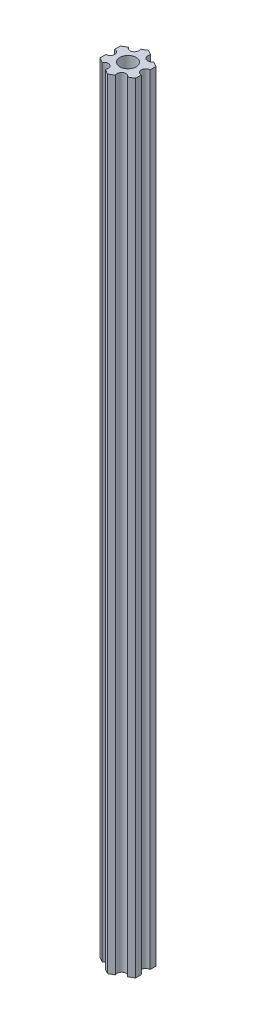
ISO-10303-21;
HEADER;
FILE_DESCRIPTION(('STEP AP214'),'2;1');
FILE_NAME('part.step','',(''),(''),'','','');
FILE_SCHEMA(('AUTOMOTIVE_DESIGN { 1 0 10303 214 1 1 1 1 }'));
ENDSEC;
DATA;
#1=APPLICATION_CONTEXT('core data for automotive mechanical design processes');
#2=APPLICATION_PROTOCOL_DEFINITION('international standard','automotive_design',2000,#1);
#3=PRODUCT_CONTEXT('',#1,'mechanical');
#4=PRODUCT('Part','Part','',(#3));
#5=PRODUCT_RELATED_PRODUCT_CATEGORY('part','',(#4));
#6=PRODUCT_DEFINITION_FORMATION('','',#4);
#7=PRODUCT_DEFINITION_CONTEXT('part definition',#1,'design');
#8=PRODUCT_DEFINITION('design','',#6,#7);
#9=PRODUCT_DEFINITION_SHAPE('','',#8);
#10=(LENGTH_UNIT() NAMED_UNIT(*) SI_UNIT(.MILLI.,.METRE.));
#11=(NAMED_UNIT(*) PLANE_ANGLE_UNIT() SI_UNIT($,.RADIAN.));
#12=(NAMED_UNIT(*) SI_UNIT($,.STERADIAN.) SOLID_ANGLE_UNIT());
#13=UNCERTAINTY_MEASURE_WITH_UNIT(LENGTH_MEASURE(1.E-05),#10,'distance_accuracy_value','');
#14=(GEOMETRIC_REPRESENTATION_CONTEXT(3) GLOBAL_UNCERTAINTY_ASSIGNED_CONTEXT((#13)) GLOBAL_UNIT_ASSIGNED_CONTEXT((#10,
#11,#12)) REPRESENTATION_CONTEXT('',''));
#15=CARTESIAN_POINT('',(0.,0.,0.));
#16=DIRECTION('',(0.,0.,1.));
#17=DIRECTION('',(1.,0.,0.));
#18=AXIS2_PLACEMENT_3D('',#15,#16,#17);
#19=CARTESIAN_POINT('',(3.175,-279.146,5.49926131403119));
#20=DIRECTION('',(0.,1.,0.));
#21=DIRECTION('',(-0.866025403784439,0.,0.5));
#22=AXIS2_PLACEMENT_3D('',#19,#20,#21);
#23=CYLINDRICAL_SURFACE('',#22,1.5875);
#24=DIRECTION('',(0.,-1.,0.));
#25=VECTOR('',#24,1.);
#26=CARTESIAN_POINT('',(1.8001846714922,-279.146,6.29301131403118));
#27=LINE('',#26,#25);
#28=CARTESIAN_POINT('',(1.8001846714922,0.,6.29301131403119));
#29=VERTEX_POINT('',#28);
#30=CARTESIAN_POINT('',(1.8001846714922,-279.146,6.29301131403119));
#31=VERTEX_POINT('',#30);
#32=EDGE_CURVE('E192',#29,#31,#27,.T.);
#33=ORIENTED_EDGE('',*,*,#32,.T.);
#34=CARTESIAN_POINT('',(3.175,-279.146,5.49926131403119));
#35=DIRECTION('',(0.,-1.,0.));
#36=DIRECTION('',(0.866025403784439,0.,-0.5));
#37=AXIS2_PLACEMENT_3D('',#34,#35,#36);
#38=CIRCLE('',#37,1.5875);
#39=CARTESIAN_POINT('',(4.5498153285078,-279.146,4.70551131403118));
#40=VERTEX_POINT('',#39);
#41=EDGE_CURVE('E274',#31,#40,#38,.T.);
#42=ORIENTED_EDGE('',*,*,#41,.T.);
#43=DIRECTION('',(0.,1.,0.));
#44=VECTOR('',#43,1.);
#45=CARTESIAN_POINT('',(4.5498153285078,-279.146,4.70551131403118));
#46=LINE('',#45,#44);
#47=CARTESIAN_POINT('',(4.5498153285078,0.,4.70551131403119));
#48=VERTEX_POINT('',#47);
#49=EDGE_CURVE('E194',#40,#48,#46,.T.);
#50=ORIENTED_EDGE('',*,*,#49,.T.);
#51=CARTESIAN_POINT('',(3.175,0.,5.49926131403119));
#52=DIRECTION('',(0.,-1.,0.));
#53=DIRECTION('',(0.866025403784439,0.,-0.5));
#54=AXIS2_PLACEMENT_3D('',#51,#52,#53);
#55=CIRCLE('',#54,1.5875);
#56=EDGE_CURVE('E189',#29,#48,#55,.T.);
#57=ORIENTED_EDGE('',*,*,#56,.F.);
#58=EDGE_LOOP('',(#33,#42,#50,#57));
#59=FACE_BOUND('',#58,.T.);
#60=ADVANCED_FACE('F17',(#59),#23,.F.);
#61=CARTESIAN_POINT('',(-3.175,-279.146,5.49926131403119));
#62=DIRECTION('',(0.,1.,0.));
#63=DIRECTION('',(-0.866025403784439,0.,-0.5));
#64=AXIS2_PLACEMENT_3D('',#61,#62,#63);
#65=CYLINDRICAL_SURFACE('',#64,1.5875);
#66=DIRECTION('',(0.,-1.,0.));
#67=VECTOR('',#66,1.);
#68=CARTESIAN_POINT('',(-4.5498153285078,-279.146,4.70551131403119));
#69=LINE('',#68,#67);
#70=CARTESIAN_POINT('',(-4.5498153285078,0.,4.70551131403119));
#71=VERTEX_POINT('',#70);
#72=CARTESIAN_POINT('',(-4.5498153285078,-279.146,4.70551131403119));
#73=VERTEX_POINT('',#72);
#74=EDGE_CURVE('E242',#71,#73,#69,.T.);
#75=ORIENTED_EDGE('',*,*,#74,.T.);
#76=CARTESIAN_POINT('',(-3.175,-279.146,5.49926131403119));
#77=DIRECTION('',(0.,-1.,0.));
#78=DIRECTION('',(0.866025403784439,0.,0.5));
#79=AXIS2_PLACEMENT_3D('',#76,#77,#78);
#80=CIRCLE('',#79,1.5875);
#81=CARTESIAN_POINT('',(-1.8001846714922,-279.146,6.29301131403119));
#82=VERTEX_POINT('',#81);
#83=EDGE_CURVE('E238',#73,#82,#80,.T.);
#84=ORIENTED_EDGE('',*,*,#83,.T.);
#85=DIRECTION('',(0.,1.,0.));
#86=VECTOR('',#85,1.);
#87=CARTESIAN_POINT('',(-1.8001846714922,-279.146,6.29301131403119));
#88=LINE('',#87,#86);
#89=CARTESIAN_POINT('',(-1.8001846714922,0.,6.29301131403119));
#90=VERTEX_POINT('',#89);
#91=EDGE_CURVE('E252',#82,#90,#88,.T.);
#92=ORIENTED_EDGE('',*,*,#91,.T.);
#93=CARTESIAN_POINT('',(-3.175,0.,5.49926131403119));
#94=DIRECTION('',(0.,-1.,0.));
#95=DIRECTION('',(0.866025403784439,0.,0.5));
#96=AXIS2_PLACEMENT_3D('',#93,#94,#95);
#97=CIRCLE('',#96,1.5875);
#98=EDGE_CURVE('E11',#71,#90,#97,.T.);
#99=ORIENTED_EDGE('',*,*,#98,.F.);
#100=EDGE_LOOP('',(#75,#84,#92,#99));
#101=FACE_BOUND('',#100,.T.);
#102=ADVANCED_FACE('F432',(#101),#65,.F.);
#103=CARTESIAN_POINT('',(-6.35,-279.146,0.));
#104=DIRECTION('',(0.,1.,0.));
#105=DIRECTION('',(0.,0.,-1.));
#106=AXIS2_PLACEMENT_3D('',#103,#104,#105);
#107=CYLINDRICAL_SURFACE('',#106,1.5875);
#108=DIRECTION('',(0.,-1.,0.));
#109=VECTOR('',#108,1.);
#110=CARTESIAN_POINT('',(-6.35,-279.146,-1.5875));
#111=LINE('',#110,#109);
#112=CARTESIAN_POINT('',(-6.35,0.,-1.5875));
#113=VERTEX_POINT('',#112);
#114=CARTESIAN_POINT('',(-6.35,-279.146,-1.5875));
#115=VERTEX_POINT('',#114);
#116=EDGE_CURVE('E271',#113,#115,#111,.T.);
#117=ORIENTED_EDGE('',*,*,#116,.T.);
#118=CARTESIAN_POINT('',(-6.35,-279.146,0.));
#119=DIRECTION('',(0.,-1.,0.));
#120=DIRECTION('',(0.,0.,1.));
#121=AXIS2_PLACEMENT_3D('',#118,#119,#120);
#122=CIRCLE('',#121,1.5875);
#123=CARTESIAN_POINT('',(-6.35,-279.146,1.5875));
#124=VERTEX_POINT('',#123);
#125=EDGE_CURVE('E234',#115,#124,#122,.T.);
#126=ORIENTED_EDGE('',*,*,#125,.T.);
#127=DIRECTION('',(0.,1.,0.));
#128=VECTOR('',#127,1.);
#129=CARTESIAN_POINT('',(-6.35,-279.146,1.5875));
#130=LINE('',#129,#128);
#131=CARTESIAN_POINT('',(-6.35,0.,1.5875));
#132=VERTEX_POINT('',#131);
#133=EDGE_CURVE('E316',#124,#132,#130,.T.);
#134=ORIENTED_EDGE('',*,*,#133,.T.);
#135=CARTESIAN_POINT('',(-6.35,0.,0.));
#136=DIRECTION('',(0.,-1.,0.));
#137=DIRECTION('',(0.,0.,1.));
#138=AXIS2_PLACEMENT_3D('',#135,#136,#137);
#139=CIRCLE('',#138,1.5875);
#140=EDGE_CURVE('E25',#113,#132,#139,.T.);
#141=ORIENTED_EDGE('',*,*,#140,.F.);
#142=EDGE_LOOP('',(#117,#126,#134,#141));
#143=FACE_BOUND('',#142,.T.);
#144=ADVANCED_FACE('F423',(#143),#107,.F.);
#145=CARTESIAN_POINT('',(-3.175,-279.146,-5.49926131403118));
#146=DIRECTION('',(0.,1.,0.));
#147=DIRECTION('',(0.866025403784439,0.,-0.5));
#148=AXIS2_PLACEMENT_3D('',#145,#146,#147);
#149=CYLINDRICAL_SURFACE('',#148,1.5875);
#150=DIRECTION('',(0.,-1.,0.));
#151=VECTOR('',#150,1.);
#152=CARTESIAN_POINT('',(-1.8001846714922,-279.146,-6.29301131403118));
#153=LINE('',#152,#151);
#154=CARTESIAN_POINT('',(-1.8001846714922,0.,-6.29301131403118));
#155=VERTEX_POINT('',#154);
#156=CARTESIAN_POINT('',(-1.8001846714922,-279.146,-6.29301131403118));
#157=VERTEX_POINT('',#156);
#158=EDGE_CURVE('E336',#155,#157,#153,.T.);
#159=ORIENTED_EDGE('',*,*,#158,.T.);
#160=CARTESIAN_POINT('',(-3.175,-279.146,-5.49926131403118));
#161=DIRECTION('',(0.,-1.,0.));
#162=DIRECTION('',(-0.866025403784439,0.,0.5));
#163=AXIS2_PLACEMENT_3D('',#160,#161,#162);
#164=CIRCLE('',#163,1.5875);
#165=CARTESIAN_POINT('',(-4.5498153285078,-279.146,-4.70551131403118));
#166=VERTEX_POINT('',#165);
#167=EDGE_CURVE('E237',#157,#166,#164,.T.);
#168=ORIENTED_EDGE('',*,*,#167,.T.);
#169=DIRECTION('',(0.,1.,0.));
#170=VECTOR('',#169,1.);
#171=CARTESIAN_POINT('',(-4.5498153285078,-279.146,-4.70551131403118));
#172=LINE('',#171,#170);
#173=CARTESIAN_POINT('',(-4.5498153285078,0.,-4.70551131403118));
#174=VERTEX_POINT('',#173);
#175=EDGE_CURVE('E227',#166,#174,#172,.T.);
#176=ORIENTED_EDGE('',*,*,#175,.T.);
#177=CARTESIAN_POINT('',(-3.175,0.,-5.49926131403118));
#178=DIRECTION('',(0.,-1.,0.));
#179=DIRECTION('',(-0.866025403784439,0.,0.5));
#180=AXIS2_PLACEMENT_3D('',#177,#178,#179);
#181=CIRCLE('',#180,1.5875);
#182=EDGE_CURVE('E223',#155,#174,#181,.T.);
#183=ORIENTED_EDGE('',*,*,#182,.F.);
#184=EDGE_LOOP('',(#159,#168,#176,#183));
#185=FACE_BOUND('',#184,.T.);
#186=ADVANCED_FACE('F408',(#185),#149,.F.);
#187=CARTESIAN_POINT('',(3.175,-279.146,-5.49926131403119));
#188=DIRECTION('',(0.,1.,0.));
#189=DIRECTION('',(0.866025403784439,0.,0.5));
#190=AXIS2_PLACEMENT_3D('',#187,#188,#189);
#191=CYLINDRICAL_SURFACE('',#190,1.5875);
#192=DIRECTION('',(0.,-1.,0.));
#193=VECTOR('',#192,1.);
#194=CARTESIAN_POINT('',(4.5498153285078,-279.146,-4.70551131403119));
#195=LINE('',#194,#193);
#196=CARTESIAN_POINT('',(4.5498153285078,0.,-4.70551131403119));
#197=VERTEX_POINT('',#196);
#198=CARTESIAN_POINT('',(4.5498153285078,-279.146,-4.70551131403119));
#199=VERTEX_POINT('',#198);
#200=EDGE_CURVE('E258',#197,#199,#195,.T.);
#201=ORIENTED_EDGE('',*,*,#200,.T.);
#202=CARTESIAN_POINT('',(3.175,-279.146,-5.49926131403119));
#203=DIRECTION('',(0.,-1.,0.));
#204=DIRECTION('',(-0.866025403784439,0.,-0.5));
#205=AXIS2_PLACEMENT_3D('',#202,#203,#204);
#206=CIRCLE('',#205,1.5875);
#207=CARTESIAN_POINT('',(1.8001846714922,-279.146,-6.29301131403119));
#208=VERTEX_POINT('',#207);
#209=EDGE_CURVE('E233',#199,#208,#206,.T.);
#210=ORIENTED_EDGE('',*,*,#209,.T.);
#211=DIRECTION('',(0.,1.,0.));
#212=VECTOR('',#211,1.);
#213=CARTESIAN_POINT('',(1.8001846714922,-279.146,-6.29301131403119));
#214=LINE('',#213,#212);
#215=CARTESIAN_POINT('',(1.8001846714922,0.,-6.29301131403119));
#216=VERTEX_POINT('',#215);
#217=EDGE_CURVE('E321',#208,#216,#214,.T.);
#218=ORIENTED_EDGE('',*,*,#217,.T.);
#219=CARTESIAN_POINT('',(3.175,0.,-5.49926131403119));
#220=DIRECTION('',(0.,-1.,0.));
#221=DIRECTION('',(-0.866025403784439,0.,-0.5));
#222=AXIS2_PLACEMENT_3D('',#219,#220,#221);
#223=CIRCLE('',#222,1.5875);
#224=EDGE_CURVE('E221',#197,#216,#223,.T.);
#225=ORIENTED_EDGE('',*,*,#224,.F.);
#226=EDGE_LOOP('',(#201,#210,#218,#225));
#227=FACE_BOUND('',#226,.T.);
#228=ADVANCED_FACE('F454',(#227),#191,.F.);
#229=CARTESIAN_POINT('',(6.35,-279.146,0.));
#230=DIRECTION('',(0.,1.,0.));
#231=DIRECTION('',(0.,0.,1.));
#232=AXIS2_PLACEMENT_3D('',#229,#230,#231);
#233=CYLINDRICAL_SURFACE('',#232,1.5875);
#234=DIRECTION('',(0.,-1.,0.));
#235=VECTOR('',#234,1.);
#236=CARTESIAN_POINT('',(6.35,-279.146,1.5875));
#237=LINE('',#236,#235);
#238=CARTESIAN_POINT('',(6.35,0.,1.5875));
#239=VERTEX_POINT('',#238);
#240=CARTESIAN_POINT('',(6.35,-279.146,1.5875));
#241=VERTEX_POINT('',#240);
#242=EDGE_CURVE('E378',#239,#241,#237,.T.);
#243=ORIENTED_EDGE('',*,*,#242,.T.);
#244=CARTESIAN_POINT('',(6.35,-279.146,0.));
#245=DIRECTION('',(0.,-1.,0.));
#246=DIRECTION('',(0.,0.,-1.));
#247=AXIS2_PLACEMENT_3D('',#244,#245,#246);
#248=CIRCLE('',#247,1.5875);
#249=CARTESIAN_POINT('',(6.35,-279.146,-1.5875));
#250=VERTEX_POINT('',#249);
#251=EDGE_CURVE('E230',#241,#250,#248,.T.);
#252=ORIENTED_EDGE('',*,*,#251,.T.);
#253=DIRECTION('',(0.,1.,0.));
#254=VECTOR('',#253,1.);
#255=CARTESIAN_POINT('',(6.35,-279.146,-1.5875));
#256=LINE('',#255,#254);
#257=CARTESIAN_POINT('',(6.35,0.,-1.5875));
#258=VERTEX_POINT('',#257);
#259=EDGE_CURVE('E299',#250,#258,#256,.T.);
#260=ORIENTED_EDGE('',*,*,#259,.T.);
#261=CARTESIAN_POINT('',(6.35,0.,0.));
#262=DIRECTION('',(0.,-1.,0.));
#263=DIRECTION('',(0.,0.,-1.));
#264=AXIS2_PLACEMENT_3D('',#261,#262,#263);
#265=CIRCLE('',#264,1.5875);
#266=EDGE_CURVE('E199',#239,#258,#265,.T.);
#267=ORIENTED_EDGE('',*,*,#266,.F.);
#268=EDGE_LOOP('',(#243,#252,#260,#267));
#269=FACE_BOUND('',#268,.T.);
#270=ADVANCED_FACE('F443',(#269),#233,.F.);
#271=CARTESIAN_POINT('',(0.,-279.146,0.));
#272=DIRECTION('',(0.,1.,0.));
#273=DIRECTION('',(0.,0.,1.));
#274=AXIS2_PLACEMENT_3D('',#271,#272,#273);
#275=CYLINDRICAL_SURFACE('',#274,2.9337);
#276=CARTESIAN_POINT('',(0.,0.,0.));
#277=DIRECTION('',(0.,-1.,0.));
#278=DIRECTION('',(0.,0.,-1.));
#279=AXIS2_PLACEMENT_3D('',#276,#277,#278);
#280=CIRCLE('',#279,2.9337);
#281=CARTESIAN_POINT('',(0.,0.,-2.9337));
#282=VERTEX_POINT('',#281);
#283=EDGE_CURVE('E35',#282,#282,#280,.T.);
#284=ORIENTED_EDGE('',*,*,#283,.F.);
#285=EDGE_LOOP('',(#284));
#286=FACE_BOUND('',#285,.T.);
#287=CARTESIAN_POINT('',(0.,-279.146,0.));
#288=DIRECTION('',(0.,-1.,0.));
#289=DIRECTION('',(0.,0.,-1.));
#290=AXIS2_PLACEMENT_3D('',#287,#288,#289);
#291=CIRCLE('',#290,2.9337);
#292=CARTESIAN_POINT('',(0.,-279.146,-2.9337));
#293=VERTEX_POINT('',#292);
#294=EDGE_CURVE('E42',#293,#293,#291,.T.);
#295=ORIENTED_EDGE('',*,*,#294,.T.);
#296=EDGE_LOOP('',(#295));
#297=FACE_BOUND('',#296,.T.);
#298=ADVANCED_FACE('F486',(#286,#297),#275,.F.);
#299=CARTESIAN_POINT('',(0.,0.,0.));
#300=DIRECTION('',(0.,-1.,0.));
#301=DIRECTION('',(0.,0.,-1.));
#302=AXIS2_PLACEMENT_3D('',#299,#300,#301);
#303=PLANE('',#302);
#304=DIRECTION('',(-0.866025403784439,0.,0.5));
#305=VECTOR('',#304,1.);
#306=CARTESIAN_POINT('',(3.175,0.,5.49926131403118));
#307=LINE('',#306,#305);
#308=CARTESIAN_POINT('',(0.,0.,7.33234841870825));
#309=VERTEX_POINT('',#308);
#310=EDGE_CURVE('E202',#29,#309,#307,.T.);
#311=ORIENTED_EDGE('',*,*,#310,.F.);
#312=ORIENTED_EDGE('',*,*,#56,.T.);
#313=DIRECTION('',(-0.866025403784439,0.,0.5));
#314=VECTOR('',#313,1.);
#315=CARTESIAN_POINT('',(3.175,0.,5.49926131403118));
#316=LINE('',#315,#314);
#317=CARTESIAN_POINT('',(6.35,0.,3.66617420935412));
#318=VERTEX_POINT('',#317);
#319=EDGE_CURVE('E239',#318,#48,#316,.T.);
#320=ORIENTED_EDGE('',*,*,#319,.F.);
#321=DIRECTION('',(0.,0.,1.));
#322=VECTOR('',#321,1.);
#323=CARTESIAN_POINT('',(6.35,0.,0.));
#324=LINE('',#323,#322);
#325=EDGE_CURVE('E382',#239,#318,#324,.T.);
#326=ORIENTED_EDGE('',*,*,#325,.F.);
#327=ORIENTED_EDGE('',*,*,#266,.T.);
#328=DIRECTION('',(0.,0.,1.));
#329=VECTOR('',#328,1.);
#330=CARTESIAN_POINT('',(6.35,0.,0.));
#331=LINE('',#330,#329);
#332=CARTESIAN_POINT('',(6.35,0.,-3.66617420935413));
#333=VERTEX_POINT('',#332);
#334=EDGE_CURVE('E275',#333,#258,#331,.T.);
#335=ORIENTED_EDGE('',*,*,#334,.F.);
#336=DIRECTION('',(0.866025403784439,0.,0.5));
#337=VECTOR('',#336,1.);
#338=CARTESIAN_POINT('',(3.175,0.,-5.49926131403119));
#339=LINE('',#338,#337);
#340=EDGE_CURVE('E253',#197,#333,#339,.T.);
#341=ORIENTED_EDGE('',*,*,#340,.F.);
#342=ORIENTED_EDGE('',*,*,#224,.T.);
#343=DIRECTION('',(0.866025403784439,0.,0.5));
#344=VECTOR('',#343,1.);
#345=CARTESIAN_POINT('',(3.175,0.,-5.49926131403119));
#346=LINE('',#345,#344);
#347=CARTESIAN_POINT('',(0.,0.,-7.33234841870825));
#348=VERTEX_POINT('',#347);
#349=EDGE_CURVE('E374',#348,#216,#346,.T.);
#350=ORIENTED_EDGE('',*,*,#349,.F.);
#351=DIRECTION('',(0.866025403784439,0.,-0.5));
#352=VECTOR('',#351,1.);
#353=CARTESIAN_POINT('',(-3.175,0.,-5.49926131403119));
#354=LINE('',#353,#352);
#355=EDGE_CURVE('E343',#155,#348,#354,.T.);
#356=ORIENTED_EDGE('',*,*,#355,.F.);
#357=ORIENTED_EDGE('',*,*,#182,.T.);
#358=DIRECTION('',(0.866025403784439,0.,-0.5));
#359=VECTOR('',#358,1.);
#360=CARTESIAN_POINT('',(-3.175,0.,-5.49926131403119));
#361=LINE('',#360,#359);
#362=CARTESIAN_POINT('',(-6.35,0.,-3.66617420935412));
#363=VERTEX_POINT('',#362);
#364=EDGE_CURVE('E357',#363,#174,#361,.T.);
#365=ORIENTED_EDGE('',*,*,#364,.F.);
#366=DIRECTION('',(0.,0.,-1.));
#367=VECTOR('',#366,1.);
#368=CARTESIAN_POINT('',(-6.35,0.,0.));
#369=LINE('',#368,#367);
#370=EDGE_CURVE('E290',#113,#363,#369,.T.);
#371=ORIENTED_EDGE('',*,*,#370,.F.);
#372=ORIENTED_EDGE('',*,*,#140,.T.);
#373=DIRECTION('',(0.,0.,-1.));
#374=VECTOR('',#373,1.);
#375=CARTESIAN_POINT('',(-6.35,0.,0.));
#376=LINE('',#375,#374);
#377=CARTESIAN_POINT('',(-6.35,0.,3.66617420935413));
#378=VERTEX_POINT('',#377);
#379=EDGE_CURVE('E329',#378,#132,#376,.T.);
#380=ORIENTED_EDGE('',*,*,#379,.F.);
#381=DIRECTION('',(-0.866025403784439,0.,-0.5));
#382=VECTOR('',#381,1.);
#383=CARTESIAN_POINT('',(-3.175,0.,5.49926131403119));
#384=LINE('',#383,#382);
#385=EDGE_CURVE('E283',#71,#378,#384,.T.);
#386=ORIENTED_EDGE('',*,*,#385,.F.);
#387=ORIENTED_EDGE('',*,*,#98,.T.);
#388=DIRECTION('',(-0.866025403784439,0.,-0.5));
#389=VECTOR('',#388,1.);
#390=CARTESIAN_POINT('',(-3.175,0.,5.49926131403119));
#391=LINE('',#390,#389);
#392=EDGE_CURVE('E205',#309,#90,#391,.T.);
#393=ORIENTED_EDGE('',*,*,#392,.F.);
#394=EDGE_LOOP('',(#311,#312,#320,#326,#327,#335,#341,#342,#350,#356,#357,#365,#371,#372,#380,
#386,#387,#393));
#395=FACE_BOUND('',#394,.T.);
#396=ORIENTED_EDGE('',*,*,#283,.T.);
#397=EDGE_LOOP('',(#396));
#398=FACE_BOUND('',#397,.T.);
#399=ADVANCED_FACE('F203',(#395,#398),#303,.F.);
#400=CARTESIAN_POINT('',(0.,-279.146,0.));
#401=DIRECTION('',(0.,-1.,0.));
#402=DIRECTION('',(0.,0.,-1.));
#403=AXIS2_PLACEMENT_3D('',#400,#401,#402);
#404=PLANE('',#403);
#405=ORIENTED_EDGE('',*,*,#41,.F.);
#406=DIRECTION('',(-0.866025403784439,0.,0.5));
#407=VECTOR('',#406,1.);
#408=CARTESIAN_POINT('',(3.175,-279.146,5.49926131403118));
#409=LINE('',#408,#407);
#410=CARTESIAN_POINT('',(0.,-279.146,7.33234841870825));
#411=VERTEX_POINT('',#410);
#412=EDGE_CURVE('E215',#31,#411,#409,.T.);
#413=ORIENTED_EDGE('',*,*,#412,.T.);
#414=DIRECTION('',(-0.866025403784439,0.,-0.5));
#415=VECTOR('',#414,1.);
#416=CARTESIAN_POINT('',(-3.175,-279.146,5.49926131403119));
#417=LINE('',#416,#415);
#418=EDGE_CURVE('E248',#411,#82,#417,.T.);
#419=ORIENTED_EDGE('',*,*,#418,.T.);
#420=ORIENTED_EDGE('',*,*,#83,.F.);
#421=DIRECTION('',(-0.866025403784439,0.,-0.5));
#422=VECTOR('',#421,1.);
#423=CARTESIAN_POINT('',(-3.175,-279.146,5.49926131403119));
#424=LINE('',#423,#422);
#425=CARTESIAN_POINT('',(-6.35,-279.146,3.66617420935413));
#426=VERTEX_POINT('',#425);
#427=EDGE_CURVE('E266',#73,#426,#424,.T.);
#428=ORIENTED_EDGE('',*,*,#427,.T.);
#429=DIRECTION('',(0.,0.,-1.));
#430=VECTOR('',#429,1.);
#431=CARTESIAN_POINT('',(-6.35,-279.146,0.));
#432=LINE('',#431,#430);
#433=EDGE_CURVE('E325',#426,#124,#432,.T.);
#434=ORIENTED_EDGE('',*,*,#433,.T.);
#435=ORIENTED_EDGE('',*,*,#125,.F.);
#436=DIRECTION('',(0.,0.,-1.));
#437=VECTOR('',#436,1.);
#438=CARTESIAN_POINT('',(-6.35,-279.146,0.));
#439=LINE('',#438,#437);
#440=CARTESIAN_POINT('',(-6.35,-279.146,-3.66617420935412));
#441=VERTEX_POINT('',#440);
#442=EDGE_CURVE('E312',#115,#441,#439,.T.);
#443=ORIENTED_EDGE('',*,*,#442,.T.);
#444=DIRECTION('',(0.866025403784439,0.,-0.5));
#445=VECTOR('',#444,1.);
#446=CARTESIAN_POINT('',(-3.175,-279.146,-5.49926131403119));
#447=LINE('',#446,#445);
#448=EDGE_CURVE('E353',#441,#166,#447,.T.);
#449=ORIENTED_EDGE('',*,*,#448,.T.);
#450=ORIENTED_EDGE('',*,*,#167,.F.);
#451=DIRECTION('',(0.866025403784439,0.,-0.5));
#452=VECTOR('',#451,1.);
#453=CARTESIAN_POINT('',(-3.175,-279.146,-5.49926131403119));
#454=LINE('',#453,#452);
#455=CARTESIAN_POINT('',(0.,-279.146,-7.33234841870825));
#456=VERTEX_POINT('',#455);
#457=EDGE_CURVE('E224',#157,#456,#454,.T.);
#458=ORIENTED_EDGE('',*,*,#457,.T.);
#459=DIRECTION('',(0.866025403784439,0.,0.5));
#460=VECTOR('',#459,1.);
#461=CARTESIAN_POINT('',(3.175,-279.146,-5.49926131403119));
#462=LINE('',#461,#460);
#463=EDGE_CURVE('E370',#456,#208,#462,.T.);
#464=ORIENTED_EDGE('',*,*,#463,.T.);
#465=ORIENTED_EDGE('',*,*,#209,.F.);
#466=DIRECTION('',(0.866025403784439,0.,0.5));
#467=VECTOR('',#466,1.);
#468=CARTESIAN_POINT('',(3.175,-279.146,-5.49926131403119));
#469=LINE('',#468,#467);
#470=CARTESIAN_POINT('',(6.35,-279.146,-3.66617420935413));
#471=VERTEX_POINT('',#470);
#472=EDGE_CURVE('E317',#199,#471,#469,.T.);
#473=ORIENTED_EDGE('',*,*,#472,.T.);
#474=DIRECTION('',(0.,0.,1.));
#475=VECTOR('',#474,1.);
#476=CARTESIAN_POINT('',(6.35,-279.146,0.));
#477=LINE('',#476,#475);
#478=EDGE_CURVE('E303',#471,#250,#477,.T.);
#479=ORIENTED_EDGE('',*,*,#478,.T.);
#480=ORIENTED_EDGE('',*,*,#251,.F.);
#481=DIRECTION('',(0.,0.,1.));
#482=VECTOR('',#481,1.);
#483=CARTESIAN_POINT('',(6.35,-279.146,0.));
#484=LINE('',#483,#482);
#485=CARTESIAN_POINT('',(6.35,-279.146,3.66617420935412));
#486=VERTEX_POINT('',#485);
#487=EDGE_CURVE('E304',#241,#486,#484,.T.);
#488=ORIENTED_EDGE('',*,*,#487,.T.);
#489=DIRECTION('',(-0.866025403784439,0.,0.5));
#490=VECTOR('',#489,1.);
#491=CARTESIAN_POINT('',(3.175,-279.146,5.49926131403118));
#492=LINE('',#491,#490);
#493=EDGE_CURVE('E262',#486,#40,#492,.T.);
#494=ORIENTED_EDGE('',*,*,#493,.T.);
#495=EDGE_LOOP('',(#405,#413,#419,#420,#428,#434,#435,#443,#449,#450,#458,#464,#465,#473,#479,
#480,#488,#494));
#496=FACE_BOUND('',#495,.T.);
#497=ORIENTED_EDGE('',*,*,#294,.F.);
#498=EDGE_LOOP('',(#497));
#499=FACE_BOUND('',#498,.T.);
#500=ADVANCED_FACE('F411',(#496,#499),#404,.T.);
#501=CARTESIAN_POINT('',(6.35,-279.146,0.));
#502=DIRECTION('',(-1.,0.,0.));
#503=DIRECTION('',(0.,1.,0.));
#504=AXIS2_PLACEMENT_3D('',#501,#502,#503);
#505=PLANE('',#504);
#506=ORIENTED_EDGE('',*,*,#259,.F.);
#507=ORIENTED_EDGE('',*,*,#478,.F.);
#508=DIRECTION('',(0.,1.,0.));
#509=VECTOR('',#508,1.);
#510=CARTESIAN_POINT('',(6.35,-279.146,-3.66617420935413));
#511=LINE('',#510,#509);
#512=EDGE_CURVE('E257',#471,#333,#511,.T.);
#513=ORIENTED_EDGE('',*,*,#512,.T.);
#514=ORIENTED_EDGE('',*,*,#334,.T.);
#515=EDGE_LOOP('',(#506,#507,#513,#514));
#516=FACE_BOUND('',#515,.T.);
#517=ADVANCED_FACE('F446',(#516),#505,.F.);
#518=CARTESIAN_POINT('',(6.35,-279.146,0.));
#519=DIRECTION('',(-1.,0.,0.));
#520=DIRECTION('',(0.,1.,0.));
#521=AXIS2_PLACEMENT_3D('',#518,#519,#520);
#522=PLANE('',#521);
#523=ORIENTED_EDGE('',*,*,#242,.F.);
#524=ORIENTED_EDGE('',*,*,#325,.T.);
#525=DIRECTION('',(0.,1.,0.));
#526=VECTOR('',#525,1.);
#527=CARTESIAN_POINT('',(6.35,-279.146,3.66617420935412));
#528=LINE('',#527,#526);
#529=EDGE_CURVE('E243',#486,#318,#528,.T.);
#530=ORIENTED_EDGE('',*,*,#529,.F.);
#531=ORIENTED_EDGE('',*,*,#487,.F.);
#532=EDGE_LOOP('',(#523,#524,#530,#531));
#533=FACE_BOUND('',#532,.T.);
#534=ADVANCED_FACE('F441',(#533),#522,.F.);
#535=CARTESIAN_POINT('',(3.175,-279.146,-5.49926131403119));
#536=DIRECTION('',(-0.5,0.,0.866025403784439));
#537=DIRECTION('',(0.,1.,0.));
#538=AXIS2_PLACEMENT_3D('',#535,#536,#537);
#539=PLANE('',#538);
#540=ORIENTED_EDGE('',*,*,#217,.F.);
#541=ORIENTED_EDGE('',*,*,#463,.F.);
#542=DIRECTION('',(0.,1.,0.));
#543=VECTOR('',#542,1.);
#544=CARTESIAN_POINT('',(0.,-279.146,-7.33234841870825));
#545=LINE('',#544,#543);
#546=EDGE_CURVE('E228',#456,#348,#545,.T.);
#547=ORIENTED_EDGE('',*,*,#546,.T.);
#548=ORIENTED_EDGE('',*,*,#349,.T.);
#549=EDGE_LOOP('',(#540,#541,#547,#548));
#550=FACE_BOUND('',#549,.T.);
#551=ADVANCED_FACE('F457',(#550),#539,.F.);
#552=CARTESIAN_POINT('',(3.175,-279.146,-5.49926131403119));
#553=DIRECTION('',(-0.5,0.,0.866025403784439));
#554=DIRECTION('',(0.,1.,0.));
#555=AXIS2_PLACEMENT_3D('',#552,#553,#554);
#556=PLANE('',#555);
#557=ORIENTED_EDGE('',*,*,#200,.F.);
#558=ORIENTED_EDGE('',*,*,#340,.T.);
#559=ORIENTED_EDGE('',*,*,#512,.F.);
#560=ORIENTED_EDGE('',*,*,#472,.F.);
#561=EDGE_LOOP('',(#557,#558,#559,#560));
#562=FACE_BOUND('',#561,.T.);
#563=ADVANCED_FACE('F452',(#562),#556,.F.);
#564=CARTESIAN_POINT('',(-3.175,-279.146,-5.49926131403119));
#565=DIRECTION('',(0.5,0.,0.866025403784439));
#566=DIRECTION('',(0.,-1.,0.));
#567=AXIS2_PLACEMENT_3D('',#564,#565,#566);
#568=PLANE('',#567);
#569=ORIENTED_EDGE('',*,*,#175,.F.);
#570=ORIENTED_EDGE('',*,*,#448,.F.);
#571=DIRECTION('',(0.,1.,0.));
#572=VECTOR('',#571,1.);
#573=CARTESIAN_POINT('',(-6.35,-279.146,-3.66617420935412));
#574=LINE('',#573,#572);
#575=EDGE_CURVE('E308',#441,#363,#574,.T.);
#576=ORIENTED_EDGE('',*,*,#575,.T.);
#577=ORIENTED_EDGE('',*,*,#364,.T.);
#578=EDGE_LOOP('',(#569,#570,#576,#577));
#579=FACE_BOUND('',#578,.T.);
#580=ADVANCED_FACE('F406',(#579),#568,.F.);
#581=CARTESIAN_POINT('',(-3.175,-279.146,-5.49926131403119));
#582=DIRECTION('',(0.5,0.,0.866025403784439));
#583=DIRECTION('',(0.,-1.,0.));
#584=AXIS2_PLACEMENT_3D('',#581,#582,#583);
#585=PLANE('',#584);
#586=ORIENTED_EDGE('',*,*,#158,.F.);
#587=ORIENTED_EDGE('',*,*,#355,.T.);
#588=ORIENTED_EDGE('',*,*,#546,.F.);
#589=ORIENTED_EDGE('',*,*,#457,.F.);
#590=EDGE_LOOP('',(#586,#587,#588,#589));
#591=FACE_BOUND('',#590,.T.);
#592=ADVANCED_FACE('F460',(#591),#585,.F.);
#593=CARTESIAN_POINT('',(-6.35,-279.146,0.));
#594=DIRECTION('',(1.,0.,0.));
#595=DIRECTION('',(0.,1.,0.));
#596=AXIS2_PLACEMENT_3D('',#593,#594,#595);
#597=PLANE('',#596);
#598=ORIENTED_EDGE('',*,*,#133,.F.);
#599=ORIENTED_EDGE('',*,*,#433,.F.);
#600=DIRECTION('',(0.,1.,0.));
#601=VECTOR('',#600,1.);
#602=CARTESIAN_POINT('',(-6.35,-279.146,3.66617420935413));
#603=LINE('',#602,#601);
#604=EDGE_CURVE('E279',#426,#378,#603,.T.);
#605=ORIENTED_EDGE('',*,*,#604,.T.);
#606=ORIENTED_EDGE('',*,*,#379,.T.);
#607=EDGE_LOOP('',(#598,#599,#605,#606));
#608=FACE_BOUND('',#607,.T.);
#609=ADVANCED_FACE('F421',(#608),#597,.F.);
#610=CARTESIAN_POINT('',(-6.35,-279.146,0.));
#611=DIRECTION('',(1.,0.,0.));
#612=DIRECTION('',(0.,1.,0.));
#613=AXIS2_PLACEMENT_3D('',#610,#611,#612);
#614=PLANE('',#613);
#615=ORIENTED_EDGE('',*,*,#116,.F.);
#616=ORIENTED_EDGE('',*,*,#370,.T.);
#617=ORIENTED_EDGE('',*,*,#575,.F.);
#618=ORIENTED_EDGE('',*,*,#442,.F.);
#619=EDGE_LOOP('',(#615,#616,#617,#618));
#620=FACE_BOUND('',#619,.T.);
#621=ADVANCED_FACE('F416',(#620),#614,.F.);
#622=CARTESIAN_POINT('',(-3.175,-279.146,5.49926131403119));
#623=DIRECTION('',(0.5,0.,-0.866025403784439));
#624=DIRECTION('',(0.,-1.,0.));
#625=AXIS2_PLACEMENT_3D('',#622,#623,#624);
#626=PLANE('',#625);
#627=ORIENTED_EDGE('',*,*,#91,.F.);
#628=ORIENTED_EDGE('',*,*,#418,.F.);
#629=DIRECTION('',(0.,1.,0.));
#630=VECTOR('',#629,1.);
#631=CARTESIAN_POINT('',(0.,-279.146,7.33234841870825));
#632=LINE('',#631,#630);
#633=EDGE_CURVE('E210',#411,#309,#632,.T.);
#634=ORIENTED_EDGE('',*,*,#633,.T.);
#635=ORIENTED_EDGE('',*,*,#392,.T.);
#636=EDGE_LOOP('',(#627,#628,#634,#635));
#637=FACE_BOUND('',#636,.T.);
#638=ADVANCED_FACE('F431',(#637),#626,.F.);
#639=CARTESIAN_POINT('',(-3.175,-279.146,5.49926131403119));
#640=DIRECTION('',(0.5,0.,-0.866025403784439));
#641=DIRECTION('',(0.,-1.,0.));
#642=AXIS2_PLACEMENT_3D('',#639,#640,#641);
#643=PLANE('',#642);
#644=ORIENTED_EDGE('',*,*,#74,.F.);
#645=ORIENTED_EDGE('',*,*,#385,.T.);
#646=ORIENTED_EDGE('',*,*,#604,.F.);
#647=ORIENTED_EDGE('',*,*,#427,.F.);
#648=EDGE_LOOP('',(#644,#645,#646,#647));
#649=FACE_BOUND('',#648,.T.);
#650=ADVANCED_FACE('F427',(#649),#643,.F.);
#651=CARTESIAN_POINT('',(3.175,-279.146,5.49926131403118));
#652=DIRECTION('',(-0.5,0.,-0.866025403784439));
#653=DIRECTION('',(-0.866025403784439,0.,0.5));
#654=AXIS2_PLACEMENT_3D('',#651,#652,#653);
#655=PLANE('',#654);
#656=ORIENTED_EDGE('',*,*,#49,.F.);
#657=ORIENTED_EDGE('',*,*,#493,.F.);
#658=ORIENTED_EDGE('',*,*,#529,.T.);
#659=ORIENTED_EDGE('',*,*,#319,.T.);
#660=EDGE_LOOP('',(#656,#657,#658,#659));
#661=FACE_BOUND('',#660,.T.);
#662=ADVANCED_FACE('F437',(#661),#655,.F.);
#663=CARTESIAN_POINT('',(3.175,-279.146,5.49926131403118));
#664=DIRECTION('',(-0.5,0.,-0.866025403784439));
#665=DIRECTION('',(-0.866025403784439,0.,0.5));
#666=AXIS2_PLACEMENT_3D('',#663,#664,#665);
#667=PLANE('',#666);
#668=ORIENTED_EDGE('',*,*,#32,.F.);
#669=ORIENTED_EDGE('',*,*,#310,.T.);
#670=ORIENTED_EDGE('',*,*,#633,.F.);
#671=ORIENTED_EDGE('',*,*,#412,.F.);
#672=EDGE_LOOP('',(#668,#669,#670,#671));
#673=FACE_BOUND('',#672,.T.);
#674=ADVANCED_FACE('F213',(#673),#667,.F.);
#675=CLOSED_SHELL('',(#60,#102,#144,#186,#228,#270,#298,#399,#500,#517,#534,#551,#563,#580,#592,
#609,#621,#638,#650,#662,#674));
#676=MANIFOLD_SOLID_BREP('B1',#675);
#677=ADVANCED_BREP_SHAPE_REPRESENTATION('',(#18,#676),#14);
#678=SHAPE_DEFINITION_REPRESENTATION(#9,#677);
ENDSEC;
END-ISO-10303-21;
